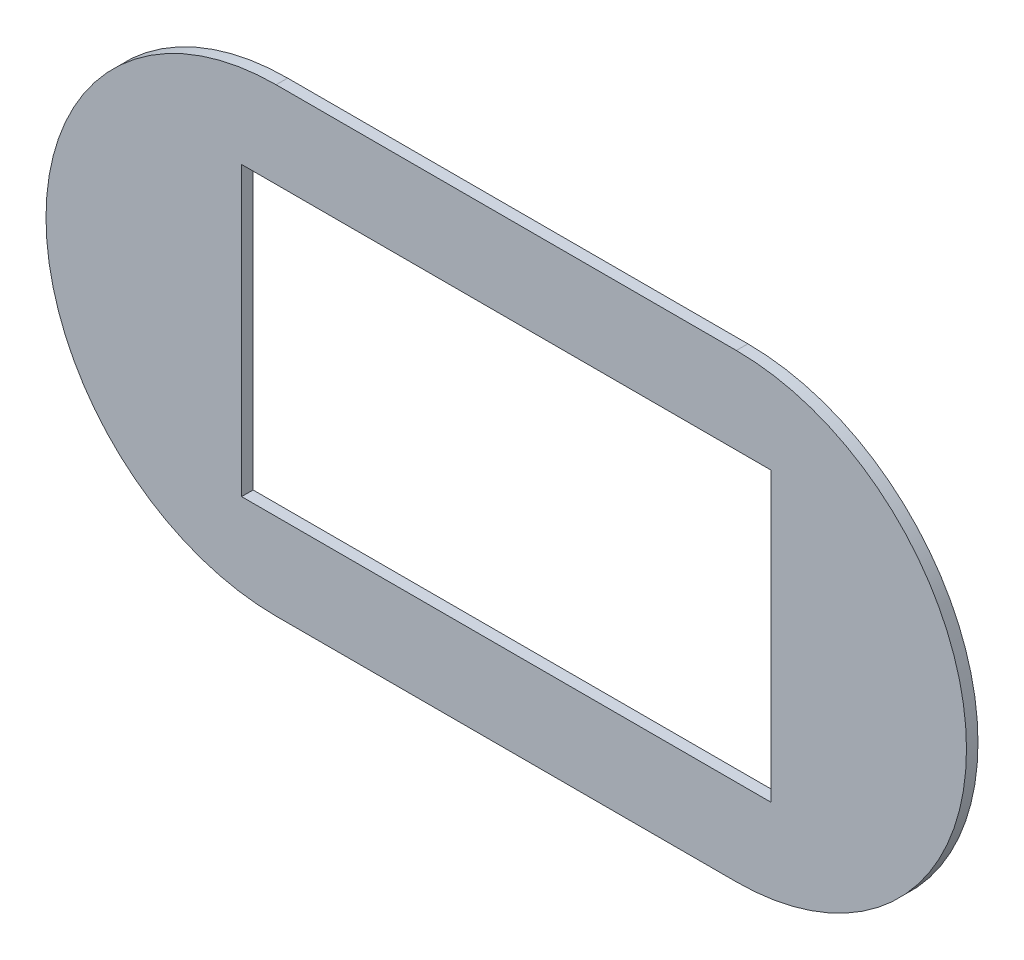
ISO-10303-21;
HEADER;
FILE_DESCRIPTION(('STEP AP214'),'2;1');
FILE_NAME('part.step','',(''),(''),'','','');
FILE_SCHEMA(('AUTOMOTIVE_DESIGN { 1 0 10303 214 1 1 1 1 }'));
ENDSEC;
DATA;
#1=APPLICATION_CONTEXT('core data for automotive mechanical design processes');
#2=APPLICATION_PROTOCOL_DEFINITION('international standard','automotive_design',2000,#1);
#3=PRODUCT_CONTEXT('',#1,'mechanical');
#4=PRODUCT('Part','Part','',(#3));
#5=PRODUCT_RELATED_PRODUCT_CATEGORY('part','',(#4));
#6=PRODUCT_DEFINITION_FORMATION('','',#4);
#7=PRODUCT_DEFINITION_CONTEXT('part definition',#1,'design');
#8=PRODUCT_DEFINITION('design','',#6,#7);
#9=PRODUCT_DEFINITION_SHAPE('','',#8);
#10=(LENGTH_UNIT() NAMED_UNIT(*) SI_UNIT(.MILLI.,.METRE.));
#11=(NAMED_UNIT(*) PLANE_ANGLE_UNIT() SI_UNIT($,.RADIAN.));
#12=(NAMED_UNIT(*) SI_UNIT($,.STERADIAN.) SOLID_ANGLE_UNIT());
#13=UNCERTAINTY_MEASURE_WITH_UNIT(LENGTH_MEASURE(1.E-05),#10,'distance_accuracy_value','');
#14=(GEOMETRIC_REPRESENTATION_CONTEXT(3) GLOBAL_UNCERTAINTY_ASSIGNED_CONTEXT((#13)) GLOBAL_UNIT_ASSIGNED_CONTEXT((#10,
#11,#12)) REPRESENTATION_CONTEXT('',''));
#15=CARTESIAN_POINT('',(0.,0.,0.));
#16=DIRECTION('',(0.,0.,1.));
#17=DIRECTION('',(1.,0.,0.));
#18=AXIS2_PLACEMENT_3D('',#15,#16,#17);
#19=CARTESIAN_POINT('',(-40.,0.,2.));
#20=DIRECTION('',(0.,0.,-1.));
#21=DIRECTION('',(-1.,0.,0.));
#22=AXIS2_PLACEMENT_3D('',#19,#20,#21);
#23=CYLINDRICAL_SURFACE('',#22,40.);
#24=CARTESIAN_POINT('',(-40.,0.,0.));
#25=DIRECTION('',(0.,0.,1.));
#26=DIRECTION('',(1.,0.,0.));
#27=AXIS2_PLACEMENT_3D('',#24,#25,#26);
#28=CIRCLE('',#27,40.);
#29=CARTESIAN_POINT('',(-40.,40.,0.));
#30=VERTEX_POINT('',#29);
#31=CARTESIAN_POINT('',(-40.,-40.,0.));
#32=VERTEX_POINT('',#31);
#33=EDGE_CURVE('E136',#30,#32,#28,.T.);
#34=ORIENTED_EDGE('',*,*,#33,.T.);
#35=DIRECTION('',(0.,0.,-1.));
#36=VECTOR('',#35,1.);
#37=CARTESIAN_POINT('',(-40.,-40.,2.));
#38=LINE('',#37,#36);
#39=CARTESIAN_POINT('',(-40.,-40.,2.));
#40=VERTEX_POINT('',#39);
#41=EDGE_CURVE('E11',#40,#32,#38,.T.);
#42=ORIENTED_EDGE('',*,*,#41,.F.);
#43=CARTESIAN_POINT('',(-40.,0.,2.));
#44=DIRECTION('',(0.,0.,1.));
#45=DIRECTION('',(1.,0.,0.));
#46=AXIS2_PLACEMENT_3D('',#43,#44,#45);
#47=CIRCLE('',#46,40.);
#48=CARTESIAN_POINT('',(-40.,40.,2.));
#49=VERTEX_POINT('',#48);
#50=EDGE_CURVE('E140',#49,#40,#47,.T.);
#51=ORIENTED_EDGE('',*,*,#50,.F.);
#52=DIRECTION('',(0.,0.,-1.));
#53=VECTOR('',#52,1.);
#54=CARTESIAN_POINT('',(-40.,40.,2.));
#55=LINE('',#54,#53);
#56=EDGE_CURVE('E150',#49,#30,#55,.T.);
#57=ORIENTED_EDGE('',*,*,#56,.T.);
#58=EDGE_LOOP('',(#34,#42,#51,#57));
#59=FACE_BOUND('',#58,.T.);
#60=ADVANCED_FACE('F41',(#59),#23,.T.);
#61=CARTESIAN_POINT('',(-40.,-40.,2.));
#62=DIRECTION('',(0.,1.,0.));
#63=DIRECTION('',(0.,0.,1.));
#64=AXIS2_PLACEMENT_3D('',#61,#62,#63);
#65=PLANE('',#64);
#66=DIRECTION('',(1.,0.,0.));
#67=VECTOR('',#66,1.);
#68=CARTESIAN_POINT('',(-40.,-40.,0.));
#69=LINE('',#68,#67);
#70=CARTESIAN_POINT('',(40.,-40.,0.));
#71=VERTEX_POINT('',#70);
#72=EDGE_CURVE('E153',#32,#71,#69,.T.);
#73=ORIENTED_EDGE('',*,*,#72,.T.);
#74=DIRECTION('',(0.,0.,-1.));
#75=VECTOR('',#74,1.);
#76=CARTESIAN_POINT('',(40.,-40.,2.));
#77=LINE('',#76,#75);
#78=CARTESIAN_POINT('',(40.,-40.,2.));
#79=VERTEX_POINT('',#78);
#80=EDGE_CURVE('E48',#79,#71,#77,.T.);
#81=ORIENTED_EDGE('',*,*,#80,.F.);
#82=DIRECTION('',(1.,0.,0.));
#83=VECTOR('',#82,1.);
#84=CARTESIAN_POINT('',(-40.,-40.,2.));
#85=LINE('',#84,#83);
#86=EDGE_CURVE('E143',#40,#79,#85,.T.);
#87=ORIENTED_EDGE('',*,*,#86,.F.);
#88=ORIENTED_EDGE('',*,*,#41,.T.);
#89=EDGE_LOOP('',(#73,#81,#87,#88));
#90=FACE_BOUND('',#89,.T.);
#91=ADVANCED_FACE('F181',(#90),#65,.F.);
#92=CARTESIAN_POINT('',(40.,0.,2.));
#93=DIRECTION('',(0.,0.,-1.));
#94=DIRECTION('',(-1.,0.,0.));
#95=AXIS2_PLACEMENT_3D('',#92,#93,#94);
#96=CYLINDRICAL_SURFACE('',#95,40.);
#97=CARTESIAN_POINT('',(40.,0.,0.));
#98=DIRECTION('',(0.,0.,1.));
#99=DIRECTION('',(1.,0.,0.));
#100=AXIS2_PLACEMENT_3D('',#97,#98,#99);
#101=CIRCLE('',#100,40.);
#102=CARTESIAN_POINT('',(40.,40.,0.));
#103=VERTEX_POINT('',#102);
#104=EDGE_CURVE('E155',#71,#103,#101,.T.);
#105=ORIENTED_EDGE('',*,*,#104,.T.);
#106=DIRECTION('',(0.,0.,-1.));
#107=VECTOR('',#106,1.);
#108=CARTESIAN_POINT('',(40.,40.,2.));
#109=LINE('',#108,#107);
#110=CARTESIAN_POINT('',(40.,40.,2.));
#111=VERTEX_POINT('',#110);
#112=EDGE_CURVE('E160',#111,#103,#109,.T.);
#113=ORIENTED_EDGE('',*,*,#112,.F.);
#114=CARTESIAN_POINT('',(40.,0.,2.));
#115=DIRECTION('',(0.,0.,1.));
#116=DIRECTION('',(1.,0.,0.));
#117=AXIS2_PLACEMENT_3D('',#114,#115,#116);
#118=CIRCLE('',#117,40.);
#119=EDGE_CURVE('E146',#79,#111,#118,.T.);
#120=ORIENTED_EDGE('',*,*,#119,.F.);
#121=ORIENTED_EDGE('',*,*,#80,.T.);
#122=EDGE_LOOP('',(#105,#113,#120,#121));
#123=FACE_BOUND('',#122,.T.);
#124=ADVANCED_FACE('F167',(#123),#96,.T.);
#125=CARTESIAN_POINT('',(-40.,40.,2.));
#126=DIRECTION('',(0.,-1.,0.));
#127=DIRECTION('',(0.,0.,-1.));
#128=AXIS2_PLACEMENT_3D('',#125,#126,#127);
#129=PLANE('',#128);
#130=DIRECTION('',(-1.,0.,0.));
#131=VECTOR('',#130,1.);
#132=CARTESIAN_POINT('',(-40.,40.,0.));
#133=LINE('',#132,#131);
#134=EDGE_CURVE('E144',#103,#30,#133,.T.);
#135=ORIENTED_EDGE('',*,*,#134,.T.);
#136=ORIENTED_EDGE('',*,*,#56,.F.);
#137=DIRECTION('',(-1.,0.,0.));
#138=VECTOR('',#137,1.);
#139=CARTESIAN_POINT('',(-40.,40.,2.));
#140=LINE('',#139,#138);
#141=EDGE_CURVE('E148',#111,#49,#140,.T.);
#142=ORIENTED_EDGE('',*,*,#141,.F.);
#143=ORIENTED_EDGE('',*,*,#112,.T.);
#144=EDGE_LOOP('',(#135,#136,#142,#143));
#145=FACE_BOUND('',#144,.T.);
#146=ADVANCED_FACE('F174',(#145),#129,.F.);
#147=CARTESIAN_POINT('',(-40.,0.,2.));
#148=DIRECTION('',(0.,0.,1.));
#149=DIRECTION('',(1.,0.,0.));
#150=AXIS2_PLACEMENT_3D('',#147,#148,#149);
#151=PLANE('',#150);
#152=DIRECTION('',(0.,1.,0.));
#153=VECTOR('',#152,1.);
#154=CARTESIAN_POINT('',(46.,-25.,2.));
#155=LINE('',#154,#153);
#156=CARTESIAN_POINT('',(46.,-25.,2.));
#157=VERTEX_POINT('',#156);
#158=CARTESIAN_POINT('',(46.,25.,2.));
#159=VERTEX_POINT('',#158);
#160=EDGE_CURVE('E55',#157,#159,#155,.T.);
#161=ORIENTED_EDGE('',*,*,#160,.F.);
#162=DIRECTION('',(-1.,0.,0.));
#163=VECTOR('',#162,1.);
#164=CARTESIAN_POINT('',(46.,-25.,2.));
#165=LINE('',#164,#163);
#166=CARTESIAN_POINT('',(-46.,-25.,2.));
#167=VERTEX_POINT('',#166);
#168=EDGE_CURVE('E121',#157,#167,#165,.T.);
#169=ORIENTED_EDGE('',*,*,#168,.T.);
#170=DIRECTION('',(0.,1.,0.));
#171=VECTOR('',#170,1.);
#172=CARTESIAN_POINT('',(-46.,-25.,2.));
#173=LINE('',#172,#171);
#174=CARTESIAN_POINT('',(-46.,25.,2.));
#175=VERTEX_POINT('',#174);
#176=EDGE_CURVE('E124',#167,#175,#173,.T.);
#177=ORIENTED_EDGE('',*,*,#176,.T.);
#178=DIRECTION('',(-1.,0.,0.));
#179=VECTOR('',#178,1.);
#180=CARTESIAN_POINT('',(46.,25.,2.));
#181=LINE('',#180,#179);
#182=EDGE_CURVE('E130',#159,#175,#181,.T.);
#183=ORIENTED_EDGE('',*,*,#182,.F.);
#184=EDGE_LOOP('',(#161,#169,#177,#183));
#185=FACE_BOUND('',#184,.T.);
#186=ORIENTED_EDGE('',*,*,#50,.T.);
#187=ORIENTED_EDGE('',*,*,#86,.T.);
#188=ORIENTED_EDGE('',*,*,#119,.T.);
#189=ORIENTED_EDGE('',*,*,#141,.T.);
#190=EDGE_LOOP('',(#186,#187,#188,#189));
#191=FACE_BOUND('',#190,.T.);
#192=ADVANCED_FACE('F180',(#185,#191),#151,.T.);
#193=CARTESIAN_POINT('',(-40.,0.,0.));
#194=DIRECTION('',(0.,0.,1.));
#195=DIRECTION('',(1.,0.,0.));
#196=AXIS2_PLACEMENT_3D('',#193,#194,#195);
#197=PLANE('',#196);
#198=DIRECTION('',(-1.,0.,0.));
#199=VECTOR('',#198,1.);
#200=CARTESIAN_POINT('',(46.,-25.,0.));
#201=LINE('',#200,#199);
#202=CARTESIAN_POINT('',(46.,-25.,0.));
#203=VERTEX_POINT('',#202);
#204=CARTESIAN_POINT('',(-46.,-25.,0.));
#205=VERTEX_POINT('',#204);
#206=EDGE_CURVE('E110',#203,#205,#201,.T.);
#207=ORIENTED_EDGE('',*,*,#206,.F.);
#208=DIRECTION('',(0.,1.,0.));
#209=VECTOR('',#208,1.);
#210=CARTESIAN_POINT('',(46.,-25.,0.));
#211=LINE('',#210,#209);
#212=CARTESIAN_POINT('',(46.,25.,0.));
#213=VERTEX_POINT('',#212);
#214=EDGE_CURVE('E107',#203,#213,#211,.T.);
#215=ORIENTED_EDGE('',*,*,#214,.T.);
#216=DIRECTION('',(-1.,0.,0.));
#217=VECTOR('',#216,1.);
#218=CARTESIAN_POINT('',(46.,25.,0.));
#219=LINE('',#218,#217);
#220=CARTESIAN_POINT('',(-46.,25.,0.));
#221=VERTEX_POINT('',#220);
#222=EDGE_CURVE('E113',#213,#221,#219,.T.);
#223=ORIENTED_EDGE('',*,*,#222,.T.);
#224=DIRECTION('',(0.,1.,0.));
#225=VECTOR('',#224,1.);
#226=CARTESIAN_POINT('',(-46.,-25.,0.));
#227=LINE('',#226,#225);
#228=EDGE_CURVE('E117',#205,#221,#227,.T.);
#229=ORIENTED_EDGE('',*,*,#228,.F.);
#230=EDGE_LOOP('',(#207,#215,#223,#229));
#231=FACE_BOUND('',#230,.T.);
#232=ORIENTED_EDGE('',*,*,#33,.F.);
#233=ORIENTED_EDGE('',*,*,#134,.F.);
#234=ORIENTED_EDGE('',*,*,#104,.F.);
#235=ORIENTED_EDGE('',*,*,#72,.F.);
#236=EDGE_LOOP('',(#232,#233,#234,#235));
#237=FACE_BOUND('',#236,.T.);
#238=ADVANCED_FACE('F119',(#231,#237),#197,.F.);
#239=CARTESIAN_POINT('',(46.,-25.,0.));
#240=DIRECTION('',(1.,0.,0.));
#241=DIRECTION('',(0.,0.,-1.));
#242=AXIS2_PLACEMENT_3D('',#239,#240,#241);
#243=PLANE('',#242);
#244=ORIENTED_EDGE('',*,*,#160,.T.);
#245=DIRECTION('',(0.,0.,1.));
#246=VECTOR('',#245,1.);
#247=CARTESIAN_POINT('',(46.,25.,0.));
#248=LINE('',#247,#246);
#249=EDGE_CURVE('E104',#213,#159,#248,.T.);
#250=ORIENTED_EDGE('',*,*,#249,.F.);
#251=ORIENTED_EDGE('',*,*,#214,.F.);
#252=DIRECTION('',(0.,0.,1.));
#253=VECTOR('',#252,1.);
#254=CARTESIAN_POINT('',(46.,-25.,0.));
#255=LINE('',#254,#253);
#256=EDGE_CURVE('E134',#203,#157,#255,.T.);
#257=ORIENTED_EDGE('',*,*,#256,.T.);
#258=EDGE_LOOP('',(#244,#250,#251,#257));
#259=FACE_BOUND('',#258,.T.);
#260=ADVANCED_FACE('F105',(#259),#243,.F.);
#261=CARTESIAN_POINT('',(46.,-25.,0.));
#262=DIRECTION('',(0.,1.,0.));
#263=DIRECTION('',(-1.,0.,0.));
#264=AXIS2_PLACEMENT_3D('',#261,#262,#263);
#265=PLANE('',#264);
#266=ORIENTED_EDGE('',*,*,#168,.F.);
#267=ORIENTED_EDGE('',*,*,#256,.F.);
#268=ORIENTED_EDGE('',*,*,#206,.T.);
#269=DIRECTION('',(0.,0.,1.));
#270=VECTOR('',#269,1.);
#271=CARTESIAN_POINT('',(-46.,-25.,0.));
#272=LINE('',#271,#270);
#273=EDGE_CURVE('E137',#205,#167,#272,.T.);
#274=ORIENTED_EDGE('',*,*,#273,.T.);
#275=EDGE_LOOP('',(#266,#267,#268,#274));
#276=FACE_BOUND('',#275,.T.);
#277=ADVANCED_FACE('F198',(#276),#265,.T.);
#278=CARTESIAN_POINT('',(-46.,-25.,0.));
#279=DIRECTION('',(1.,0.,0.));
#280=DIRECTION('',(0.,0.,-1.));
#281=AXIS2_PLACEMENT_3D('',#278,#279,#280);
#282=PLANE('',#281);
#283=ORIENTED_EDGE('',*,*,#176,.F.);
#284=ORIENTED_EDGE('',*,*,#273,.F.);
#285=ORIENTED_EDGE('',*,*,#228,.T.);
#286=DIRECTION('',(0.,0.,1.));
#287=VECTOR('',#286,1.);
#288=CARTESIAN_POINT('',(-46.,25.,0.));
#289=LINE('',#288,#287);
#290=EDGE_CURVE('E63',#221,#175,#289,.T.);
#291=ORIENTED_EDGE('',*,*,#290,.T.);
#292=EDGE_LOOP('',(#283,#284,#285,#291));
#293=FACE_BOUND('',#292,.T.);
#294=ADVANCED_FACE('F201',(#293),#282,.T.);
#295=CARTESIAN_POINT('',(46.,25.,0.));
#296=DIRECTION('',(0.,1.,0.));
#297=DIRECTION('',(-1.,0.,0.));
#298=AXIS2_PLACEMENT_3D('',#295,#296,#297);
#299=PLANE('',#298);
#300=ORIENTED_EDGE('',*,*,#182,.T.);
#301=ORIENTED_EDGE('',*,*,#290,.F.);
#302=ORIENTED_EDGE('',*,*,#222,.F.);
#303=ORIENTED_EDGE('',*,*,#249,.T.);
#304=EDGE_LOOP('',(#300,#301,#302,#303));
#305=FACE_BOUND('',#304,.T.);
#306=ADVANCED_FACE('F114',(#305),#299,.F.);
#307=CLOSED_SHELL('',(#60,#91,#124,#146,#192,#238,#260,#277,#294,#306));
#308=MANIFOLD_SOLID_BREP('B2',#307);
#309=ADVANCED_BREP_SHAPE_REPRESENTATION('',(#18,#308),#14);
#310=SHAPE_DEFINITION_REPRESENTATION(#9,#309);
ENDSEC;
END-ISO-10303-21;
